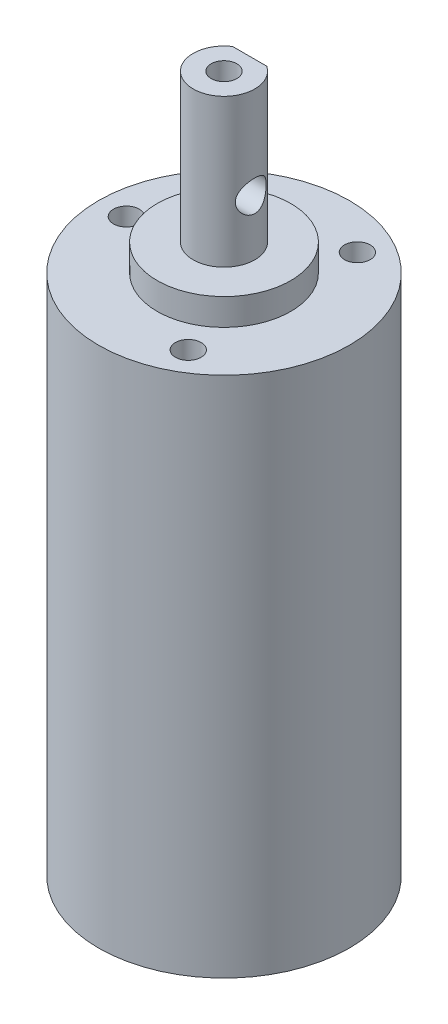
ISO-10303-21;
HEADER;
FILE_DESCRIPTION(('STEP AP214'),'2;1');
FILE_NAME('part.step','',(''),(''),'','','');
FILE_SCHEMA(('AUTOMOTIVE_DESIGN { 1 0 10303 214 1 1 1 1 }'));
ENDSEC;
DATA;
#1=APPLICATION_CONTEXT('core data for automotive mechanical design processes');
#2=APPLICATION_PROTOCOL_DEFINITION('international standard','automotive_design',2000,#1);
#3=PRODUCT_CONTEXT('',#1,'mechanical');
#4=PRODUCT('Part','Part','',(#3));
#5=PRODUCT_RELATED_PRODUCT_CATEGORY('part','',(#4));
#6=PRODUCT_DEFINITION_FORMATION('','',#4);
#7=PRODUCT_DEFINITION_CONTEXT('part definition',#1,'design');
#8=PRODUCT_DEFINITION('design','',#6,#7);
#9=PRODUCT_DEFINITION_SHAPE('','',#8);
#10=(LENGTH_UNIT() NAMED_UNIT(*) SI_UNIT(.MILLI.,.METRE.));
#11=(NAMED_UNIT(*) PLANE_ANGLE_UNIT() SI_UNIT($,.RADIAN.));
#12=(NAMED_UNIT(*) SI_UNIT($,.STERADIAN.) SOLID_ANGLE_UNIT());
#13=UNCERTAINTY_MEASURE_WITH_UNIT(LENGTH_MEASURE(1.E-05),#10,'distance_accuracy_value','');
#14=(GEOMETRIC_REPRESENTATION_CONTEXT(3) GLOBAL_UNCERTAINTY_ASSIGNED_CONTEXT((#13)) GLOBAL_UNIT_ASSIGNED_CONTEXT((#10,
#11,#12)) REPRESENTATION_CONTEXT('',''));
#15=CARTESIAN_POINT('',(0.,0.,0.));
#16=DIRECTION('',(0.,0.,1.));
#17=DIRECTION('',(1.,0.,0.));
#18=AXIS2_PLACEMENT_3D('',#15,#16,#17);
#19=CARTESIAN_POINT('',(-30.24092982811,133.5110309145,106.2415147261));
#20=DIRECTION('',(0.,1.,0.));
#21=DIRECTION('',(0.,0.,1.));
#22=AXIS2_PLACEMENT_3D('',#19,#20,#21);
#23=CONICAL_SURFACE('',#22,0.,1.02974425870939);
#24=CARTESIAN_POINT('',(-30.24092982811,133.5110309145,106.2415147261));
#25=VERTEX_POINT('',#24);
#26=VERTEX_LOOP('',#25);
#27=FACE_BOUND('',#26,.T.);
#28=CARTESIAN_POINT('',(-30.24092982811,134.2621066882,106.2415147261));
#29=DIRECTION('',(0.,1.,0.));
#30=DIRECTION('',(0.,0.,-1.));
#31=AXIS2_PLACEMENT_3D('',#28,#29,#30);
#32=CIRCLE('',#31,1.25000000000004);
#33=CARTESIAN_POINT('',(-30.24092982811,134.2621066882,104.9915147261));
#34=VERTEX_POINT('',#33);
#35=EDGE_CURVE('E142',#34,#34,#32,.F.);
#36=ORIENTED_EDGE('',*,*,#35,.F.);
#37=EDGE_LOOP('',(#36));
#38=FACE_BOUND('',#37,.T.);
#39=ADVANCED_FACE('F16',(#27,#38),#23,.F.);
#40=CARTESIAN_POINT('',(-30.24092982811,134.2621066882,106.2415147261));
#41=DIRECTION('',(0.,1.,0.));
#42=DIRECTION('',(0.,0.,1.));
#43=AXIS2_PLACEMENT_3D('',#40,#41,#42);
#44=CYLINDRICAL_SURFACE('',#43,1.25000000000003);
#45=CARTESIAN_POINT('',(-30.24092982811,139.7621066882,106.2415147261));
#46=DIRECTION('',(0.,1.,0.));
#47=DIRECTION('',(0.,0.,1.));
#48=AXIS2_PLACEMENT_3D('',#45,#46,#47);
#49=CIRCLE('',#48,1.25000000000003);
#50=CARTESIAN_POINT('',(-30.24092982811,139.7621066882,107.4915147261));
#51=VERTEX_POINT('',#50);
#52=EDGE_CURVE('E20',#51,#51,#49,.T.);
#53=ORIENTED_EDGE('',*,*,#52,.T.);
#54=EDGE_LOOP('',(#53));
#55=FACE_BOUND('',#54,.T.);
#56=ORIENTED_EDGE('',*,*,#35,.T.);
#57=EDGE_LOOP('',(#56));
#58=FACE_BOUND('',#57,.T.);
#59=ADVANCED_FACE('F266',(#55,#58),#44,.F.);
#60=CARTESIAN_POINT('',(-27.11965647509,139.7621066882,103.6315147261));
#61=DIRECTION('',(0.,-1.,0.));
#62=DIRECTION('',(0.,0.,1.));
#63=AXIS2_PLACEMENT_3D('',#60,#61,#62);
#64=PLANE('',#63);
#65=ORIENTED_EDGE('',*,*,#52,.F.);
#66=EDGE_LOOP('',(#65));
#67=FACE_BOUND('',#66,.T.);
#68=DIRECTION('',(-1.,0.,0.));
#69=VECTOR('',#68,1.);
#70=CARTESIAN_POINT('',(-30.240929828115,139.7621066882,103.7415147261));
#71=LINE('',#70,#69);
#72=CARTESIAN_POINT('',(-28.5826174329317,139.7621066882,103.7415147261));
#73=VERTEX_POINT('',#72);
#74=CARTESIAN_POINT('',(-31.8992422232878,139.7621066882,103.7415147261));
#75=VERTEX_POINT('',#74);
#76=EDGE_CURVE('E131',#73,#75,#71,.T.);
#77=ORIENTED_EDGE('',*,*,#76,.T.);
#78=CARTESIAN_POINT('',(-30.24092982811,139.7621066882,106.2415147261));
#79=DIRECTION('',(0.,1.,0.));
#80=DIRECTION('',(0.,0.,1.));
#81=AXIS2_PLACEMENT_3D('',#78,#79,#80);
#82=CIRCLE('',#81,3.00000000000002);
#83=EDGE_CURVE('E77',#75,#73,#82,.T.);
#84=ORIENTED_EDGE('',*,*,#83,.T.);
#85=EDGE_LOOP('',(#77,#84));
#86=FACE_BOUND('',#85,.T.);
#87=ADVANCED_FACE('F276',(#67,#86),#64,.F.);
#88=CARTESIAN_POINT('',(-28.48132464005,139.9921066882,103.7415147261));
#89=DIRECTION('',(0.,0.,1.));
#90=DIRECTION('',(-1.,0.,0.));
#91=AXIS2_PLACEMENT_3D('',#88,#89,#90);
#92=PLANE('',#91);
#93=ORIENTED_EDGE('',*,*,#76,.F.);
#94=DIRECTION('',(0.,-1.,0.));
#95=VECTOR('',#94,1.);
#96=CARTESIAN_POINT('',(-28.5826174329312,132.5621066882,103.741514726101));
#97=LINE('',#96,#95);
#98=CARTESIAN_POINT('',(-28.5826174329237,128.2621066882,103.741514726106));
#99=VERTEX_POINT('',#98);
#100=EDGE_CURVE('E132',#73,#99,#97,.T.);
#101=ORIENTED_EDGE('',*,*,#100,.T.);
#102=DIRECTION('',(1.,0.,0.));
#103=VECTOR('',#102,1.);
#104=CARTESIAN_POINT('',(-30.240929828115,128.2621066882,103.741514726111));
#105=LINE('',#104,#103);
#106=CARTESIAN_POINT('',(-31.8992422232958,128.2621066882,103.741514726105));
#107=VERTEX_POINT('',#106);
#108=EDGE_CURVE('E127',#107,#99,#105,.T.);
#109=ORIENTED_EDGE('',*,*,#108,.F.);
#110=DIRECTION('',(0.,1.,0.));
#111=VECTOR('',#110,1.);
#112=CARTESIAN_POINT('',(-31.8992422232878,132.5621066882,103.7415147261));
#113=LINE('',#112,#111);
#114=EDGE_CURVE('E130',#107,#75,#113,.T.);
#115=ORIENTED_EDGE('',*,*,#114,.T.);
#116=EDGE_LOOP('',(#93,#101,#109,#115));
#117=FACE_BOUND('',#116,.T.);
#118=ADVANCED_FACE('F278',(#117),#92,.F.);
#119=CARTESIAN_POINT('',(-28.48132464005,128.2621066882,103.842807519));
#120=DIRECTION('',(0.,1.,0.));
#121=DIRECTION('',(0.,0.,-1.));
#122=AXIS2_PLACEMENT_3D('',#119,#120,#121);
#123=PLANE('',#122);
#124=CARTESIAN_POINT('',(-30.24092982811,128.2621066882,106.2415147261));
#125=DIRECTION('',(0.,1.,0.));
#126=DIRECTION('',(0.,0.,1.));
#127=AXIS2_PLACEMENT_3D('',#124,#125,#126);
#128=CIRCLE('',#127,3.00000000000002);
#129=EDGE_CURVE('E83',#99,#107,#128,.T.);
#130=ORIENTED_EDGE('',*,*,#129,.T.);
#131=ORIENTED_EDGE('',*,*,#108,.T.);
#132=EDGE_LOOP('',(#130,#131));
#133=FACE_BOUND('',#132,.T.);
#134=ADVANCED_FACE('F262',(#133),#123,.T.);
#135=CARTESIAN_POINT('',(-33.2853238036323,130.7621066882,106.2415147261));
#136=DIRECTION('',(1.,0.,0.));
#137=DIRECTION('',(0.,0.,-1.));
#138=AXIS2_PLACEMENT_3D('',#135,#136,#137);
#139=CYLINDRICAL_SURFACE('',#138,1.49999999999999);
#140=CARTESIAN_POINT('',(-27.6428536167567,130.7621066882,104.7415147261));
#141=CARTESIAN_POINT('',(-27.6428477603225,130.84033262417,104.741519320605));
#142=CARTESIAN_POINT('',(-27.6392699054852,130.918604656265,104.747669911345));
#143=CARTESIAN_POINT('',(-27.6254852999889,131.07270498456,104.771945779615));
#144=CARTESIAN_POINT('',(-27.6152703311411,131.148530128639,104.790085903271));
#145=CARTESIAN_POINT('',(-27.5896908838176,131.295279452717,104.837362534096));
#146=CARTESIAN_POINT('',(-27.5743520639114,131.366225969908,104.86644433879));
#147=CARTESIAN_POINT('',(-27.5402933391923,131.502230254308,104.934606148255));
#148=CARTESIAN_POINT('',(-27.5215726218326,131.567286600673,104.973688556749));
#149=CARTESIAN_POINT('',(-27.4809764230692,131.695566637006,105.064515747349));
#150=CARTESIAN_POINT('',(-27.4589680985602,131.758197648499,105.117038524389));
#151=CARTESIAN_POINT('',(-27.4153493236102,131.874221103778,105.231636201916));
#152=CARTESIAN_POINT('',(-27.3937390616737,131.927609266221,105.293715504025));
#153=CARTESIAN_POINT('',(-27.3516077081944,132.02715734866,105.430780270438));
#154=CARTESIAN_POINT('',(-27.3312582945756,132.072587203727,105.50635370932));
#155=CARTESIAN_POINT('',(-27.2956685333971,132.149817866662,105.665278930494));
#156=CARTESIAN_POINT('',(-27.2804249784294,132.181627234183,105.748625787433));
#157=CARTESIAN_POINT('',(-27.2577229279904,132.228363642914,105.914447174233));
#158=CARTESIAN_POINT('',(-27.249787651682,132.244330923989,105.996561760009));
#159=CARTESIAN_POINT('',(-27.2408160741969,132.262355858363,106.162658496225));
#160=CARTESIAN_POINT('',(-27.2397756221048,132.264421880697,106.246639492459));
#161=CARTESIAN_POINT('',(-27.2444851036875,132.254986669662,106.406263658226));
#162=CARTESIAN_POINT('',(-27.2496524097742,132.244649628664,106.481996813983));
#163=CARTESIAN_POINT('',(-27.2653161890193,132.212785336855,106.630485662172));
#164=CARTESIAN_POINT('',(-27.2758130406679,132.191257291284,106.703241142741));
#165=CARTESIAN_POINT('',(-27.3013561813976,132.137482637118,106.844979378432));
#166=CARTESIAN_POINT('',(-27.3164634470906,132.105091752489,106.913895951756));
#167=CARTESIAN_POINT('',(-27.3498654278205,132.030710846309,107.045480931506));
#168=CARTESIAN_POINT('',(-27.3681612330393,131.988717540092,107.108147189349));
#169=CARTESIAN_POINT('',(-27.4082620563166,131.891768363245,107.231769457079));
#170=CARTESIAN_POINT('',(-27.4302353056701,131.835962848301,107.292005051284));
#171=CARTESIAN_POINT('',(-27.4741107890229,131.715232897263,107.402662365103));
#172=CARTESIAN_POINT('',(-27.4960129364639,131.650299907538,107.453074772138));
#173=CARTESIAN_POINT('',(-27.5387805116918,131.508094562784,107.545800441645));
#174=CARTESIAN_POINT('',(-27.5594897573667,131.430298327221,107.587388411701));
#175=CARTESIAN_POINT('',(-27.5953154692078,131.267588401397,107.656526951154));
#176=CARTESIAN_POINT('',(-27.6104442215047,131.182690857615,107.684108408668));
#177=CARTESIAN_POINT('',(-27.6284675967506,131.041189394481,107.71638243035));
#178=CARTESIAN_POINT('',(-27.6338230686247,130.985935509444,107.725781009089));
#179=CARTESIAN_POINT('',(-27.6410178770572,130.874497802961,107.738348266184));
#180=CARTESIAN_POINT('',(-27.6428578247635,130.818314144862,107.741518027376));
#181=CARTESIAN_POINT('',(-27.6428477603225,130.68388075223,107.741510131595));
#182=CARTESIAN_POINT('',(-27.6392699054852,130.605608720135,107.735359540855));
#183=CARTESIAN_POINT('',(-27.6254852999889,130.45150839184,107.711083672585));
#184=CARTESIAN_POINT('',(-27.6152703311411,130.375683247761,107.692943548929));
#185=CARTESIAN_POINT('',(-27.5896908838176,130.228933923683,107.645666918105));
#186=CARTESIAN_POINT('',(-27.5743520639115,130.157987406492,107.616585113411));
#187=CARTESIAN_POINT('',(-27.5402933391923,130.021983122092,107.548423303945));
#188=CARTESIAN_POINT('',(-27.5215726218326,129.956926775727,107.509340895451));
#189=CARTESIAN_POINT('',(-27.4809764230692,129.828646739394,107.418513704851));
#190=CARTESIAN_POINT('',(-27.4589680985602,129.766015727902,107.365990927811));
#191=CARTESIAN_POINT('',(-27.4153493236102,129.649992272622,107.251393250284));
#192=CARTESIAN_POINT('',(-27.3937390616737,129.596604110179,107.189313948175));
#193=CARTESIAN_POINT('',(-27.3516077081945,129.49705602774,107.052249181762));
#194=CARTESIAN_POINT('',(-27.3312582945756,129.451626172673,106.97667574288));
#195=CARTESIAN_POINT('',(-27.2956685333971,129.374395509738,106.817750521706));
#196=CARTESIAN_POINT('',(-27.2804249784294,129.342586142217,106.734403664767));
#197=CARTESIAN_POINT('',(-27.2577229279904,129.295849733486,106.568582277967));
#198=CARTESIAN_POINT('',(-27.249787651682,129.279882452411,106.486467692191));
#199=CARTESIAN_POINT('',(-27.240816074197,129.261857518037,106.320370955975));
#200=CARTESIAN_POINT('',(-27.2397756221048,129.259791495703,106.236389959741));
#201=CARTESIAN_POINT('',(-27.2444851036875,129.269226706738,106.076765793974));
#202=CARTESIAN_POINT('',(-27.2496524097742,129.279563747735,106.001032638217));
#203=CARTESIAN_POINT('',(-27.2653161890193,129.311428039545,105.852543790028));
#204=CARTESIAN_POINT('',(-27.2758130406679,129.332956085115,105.779788309459));
#205=CARTESIAN_POINT('',(-27.3013561813975,129.386730739282,105.638050073768));
#206=CARTESIAN_POINT('',(-27.3164634470905,129.419121623911,105.569133500444));
#207=CARTESIAN_POINT('',(-27.3498654278205,129.493502530091,105.437548520694));
#208=CARTESIAN_POINT('',(-27.3681612330393,129.535495836308,105.374882262851));
#209=CARTESIAN_POINT('',(-27.4082620563166,129.632445013155,105.251259995121));
#210=CARTESIAN_POINT('',(-27.43023530567,129.688250528099,105.191024400916));
#211=CARTESIAN_POINT('',(-27.4741107890229,129.808980479137,105.080367087097));
#212=CARTESIAN_POINT('',(-27.4960129364638,129.873913468862,105.029954680062));
#213=CARTESIAN_POINT('',(-27.5387805116918,130.016118813616,104.937229010555));
#214=CARTESIAN_POINT('',(-27.5594897573667,130.093915049178,104.895641040499));
#215=CARTESIAN_POINT('',(-27.5953154692078,130.256624975003,104.826502501046));
#216=CARTESIAN_POINT('',(-27.6104442215047,130.341522518785,104.798921043532));
#217=CARTESIAN_POINT('',(-27.6284675967506,130.483023981919,104.76664702185));
#218=CARTESIAN_POINT('',(-27.6338230686247,130.538277866956,104.757248443111));
#219=CARTESIAN_POINT('',(-27.6410178770572,130.649715573439,104.744681186016));
#220=CARTESIAN_POINT('',(-27.6428578247635,130.705899231538,104.741511424824));
#221=CARTESIAN_POINT('',(-27.6428536167567,130.7621066882,104.7415147261));
#222=B_SPLINE_CURVE_WITH_KNOTS('',3,(#140,#141,#142,#143,#144,#145,#146,#147,#148,#149,#150,
#151,#152,#153,#154,#155,#156,#157,#158,#159,#160,#161,#162,#163,#164,#165,#166,#167,#168,#169,
#170,#171,#172,#173,#174,#175,#176,#177,#178,#179,#180,#181,#182,#183,#184,#185,#186,#187,#188,
#189,#190,#191,#192,#193,#194,#195,#196,#197,#198,#199,#200,#201,#202,#203,#204,#205,#206,#207,
#208,#209,#210,#211,#212,#213,#214,#215,#216,#217,#218,#219,#220,#221),.UNSPECIFIED.,.T.,.F.,(4,
2,2,2,2,2,2,2,2,2,2,2,2,2,2,2,2,2,2,2,2,2,2,2,2,2,2,2,2,2,2,2,2,2,2,2,2,2,2,2,4),(0.,
0.234449231901209,0.469189317529201,0.702771096664719,0.936409071807249,1.18929789692149,
1.44230355005485,1.71236795365525,1.98226238811297,2.23295183209194,2.48349033889637,
2.71224188129933,2.94100967129785,3.17294484424671,3.4049594734386,3.65888530601413,
3.91305070653475,4.18349069032567,4.45333166290755,4.6218190877885,4.79027721971543,
5.02472645161661,5.2594665372446,5.49304831638011,5.72668629152262,5.97957511663684,
6.23258076977018,6.5026451733706,6.77253960782835,7.02322905180731,7.27376755861176,
7.50251910101472,7.73128689101325,7.96322206396209,8.19523669315399,8.44916252572951,
8.70332792625011,8.97376791004105,9.24360888262294,9.41209630750402,9.58055443943098),.UNSPECIFIED.);
#223=CARTESIAN_POINT('',(-27.6428536167567,130.7621066882,104.7415147261));
#224=VERTEX_POINT('',#223);
#225=EDGE_CURVE('E245',#224,#224,#222,.T.);
#226=ORIENTED_EDGE('',*,*,#225,.T.);
#227=EDGE_LOOP('',(#226));
#228=FACE_BOUND('',#227,.T.);
#229=CARTESIAN_POINT('',(-32.8390060394633,130.7621066882,104.7415147261));
#230=CARTESIAN_POINT('',(-32.8390118958975,130.683880752231,104.741519320605));
#231=CARTESIAN_POINT('',(-32.8425897507348,130.605608720136,104.747669911345));
#232=CARTESIAN_POINT('',(-32.8563743562311,130.45150839184,104.771945779615));
#233=CARTESIAN_POINT('',(-32.8665893250788,130.375683247761,104.790085903271));
#234=CARTESIAN_POINT('',(-32.8921687724024,130.228933923684,104.837362534095));
#235=CARTESIAN_POINT('',(-32.9075075923085,130.157987406492,104.866444338789));
#236=CARTESIAN_POINT('',(-32.9415663170276,130.021983122092,104.934606148255));
#237=CARTESIAN_POINT('',(-32.9602870343873,129.956926775727,104.973688556749));
#238=CARTESIAN_POINT('',(-33.0008832331507,129.828646739394,105.064515747349));
#239=CARTESIAN_POINT('',(-33.0228915576597,129.766015727902,105.117038524388));
#240=CARTESIAN_POINT('',(-33.0665103326097,129.649992272623,105.231636201916));
#241=CARTESIAN_POINT('',(-33.0881205945463,129.596604110179,105.293715504025));
#242=CARTESIAN_POINT('',(-33.1302519480255,129.49705602774,105.430780270438));
#243=CARTESIAN_POINT('',(-33.1506013616444,129.451626172673,105.50635370932));
#244=CARTESIAN_POINT('',(-33.1861911228229,129.374395509738,105.665278930494));
#245=CARTESIAN_POINT('',(-33.2014346777906,129.342586142217,105.748625787433));
#246=CARTESIAN_POINT('',(-33.2241367282296,129.295849733486,105.914447174233));
#247=CARTESIAN_POINT('',(-33.2320720045379,129.279882452411,105.996561760009));
#248=CARTESIAN_POINT('',(-33.241043582023,129.261857518037,106.162658496224));
#249=CARTESIAN_POINT('',(-33.2420840341152,129.259791495703,106.246639492458));
#250=CARTESIAN_POINT('',(-33.2373745525325,129.269226706738,106.406263658225));
#251=CARTESIAN_POINT('',(-33.2322072464459,129.279563747735,106.481996813983));
#252=CARTESIAN_POINT('',(-33.2165434672007,129.311428039545,106.630485662172));
#253=CARTESIAN_POINT('',(-33.2060466155522,129.332956085115,106.703241142741));
#254=CARTESIAN_POINT('',(-33.1805034748225,129.386730739282,106.844979378432));
#255=CARTESIAN_POINT('',(-33.1653962091295,129.419121623911,106.913895951756));
#256=CARTESIAN_POINT('',(-33.1319942283995,129.493502530091,107.045480931506));
#257=CARTESIAN_POINT('',(-33.1136984231807,129.535495836308,107.108147189349));
#258=CARTESIAN_POINT('',(-33.0735975999035,129.632445013155,107.231769457079));
#259=CARTESIAN_POINT('',(-33.05162435055,129.688250528098,107.292005051283));
#260=CARTESIAN_POINT('',(-33.0077488671972,129.808980479136,107.402662365102));
#261=CARTESIAN_POINT('',(-32.9858467197562,129.873913468862,107.453074772138));
#262=CARTESIAN_POINT('',(-32.9430791445283,130.016118813616,107.545800441645));
#263=CARTESIAN_POINT('',(-32.9223698988534,130.093915049178,107.587388411701));
#264=CARTESIAN_POINT('',(-32.8865441870123,130.256624975002,107.656526951153));
#265=CARTESIAN_POINT('',(-32.8714154347154,130.341522518785,107.684108408668));
#266=CARTESIAN_POINT('',(-32.8533920594694,130.483023981919,107.71638243035));
#267=CARTESIAN_POINT('',(-32.8480365875954,130.538277866956,107.725781009089));
#268=CARTESIAN_POINT('',(-32.8408417791628,130.649715573439,107.738348266184));
#269=CARTESIAN_POINT('',(-32.8390018314565,130.705899231537,107.741518027376));
#270=CARTESIAN_POINT('',(-32.8390118958975,130.840332624169,107.741510131595));
#271=CARTESIAN_POINT('',(-32.8425897507348,130.918604656265,107.735359540855));
#272=CARTESIAN_POINT('',(-32.8563743562311,131.07270498456,107.711083672585));
#273=CARTESIAN_POINT('',(-32.8665893250789,131.148530128639,107.692943548929));
#274=CARTESIAN_POINT('',(-32.8921687724024,131.295279452717,107.645666918105));
#275=CARTESIAN_POINT('',(-32.9075075923085,131.366225969908,107.616585113411));
#276=CARTESIAN_POINT('',(-32.9415663170277,131.502230254308,107.548423303945));
#277=CARTESIAN_POINT('',(-32.9602870343873,131.567286600673,107.509340895451));
#278=CARTESIAN_POINT('',(-33.0008832331508,131.695566637006,107.418513704851));
#279=CARTESIAN_POINT('',(-33.0228915576598,131.758197648498,107.365990927811));
#280=CARTESIAN_POINT('',(-33.0665103326097,131.874221103778,107.251393250284));
#281=CARTESIAN_POINT('',(-33.0881205945463,131.927609266221,107.189313948175));
#282=CARTESIAN_POINT('',(-33.1302519480255,132.02715734866,107.052249181762));
#283=CARTESIAN_POINT('',(-33.1506013616444,132.072587203727,106.97667574288));
#284=CARTESIAN_POINT('',(-33.1861911228229,132.149817866662,106.817750521706));
#285=CARTESIAN_POINT('',(-33.2014346777906,132.181627234183,106.734403664767));
#286=CARTESIAN_POINT('',(-33.2241367282296,132.228363642914,106.568582277967));
#287=CARTESIAN_POINT('',(-33.2320720045379,132.244330923989,106.486467692191));
#288=CARTESIAN_POINT('',(-33.241043582023,132.262355858363,106.320370955975));
#289=CARTESIAN_POINT('',(-33.2420840341152,132.264421880697,106.236389959741));
#290=CARTESIAN_POINT('',(-33.2373745525325,132.254986669662,106.076765793974));
#291=CARTESIAN_POINT('',(-33.2322072464458,132.244649628664,106.001032638217));
#292=CARTESIAN_POINT('',(-33.2165434672007,132.212785336855,105.852543790028));
#293=CARTESIAN_POINT('',(-33.2060466155521,132.191257291284,105.779788309459));
#294=CARTESIAN_POINT('',(-33.1805034748225,132.137482637118,105.638050073768));
#295=CARTESIAN_POINT('',(-33.1653962091295,132.105091752489,105.569133500444));
#296=CARTESIAN_POINT('',(-33.1319942283995,132.030710846309,105.437548520694));
#297=CARTESIAN_POINT('',(-33.1136984231807,131.988717540092,105.374882262851));
#298=CARTESIAN_POINT('',(-33.0735975999034,131.891768363245,105.251259995121));
#299=CARTESIAN_POINT('',(-33.05162435055,131.835962848302,105.191024400916));
#300=CARTESIAN_POINT('',(-33.0077488671971,131.715232897263,105.080367087097));
#301=CARTESIAN_POINT('',(-32.9858467197562,131.650299907538,105.029954680062));
#302=CARTESIAN_POINT('',(-32.9430791445283,131.508094562784,104.937229010555));
#303=CARTESIAN_POINT('',(-32.9223698988533,131.430298327222,104.895641040499));
#304=CARTESIAN_POINT('',(-32.8865441870122,131.267588401398,104.826502501047));
#305=CARTESIAN_POINT('',(-32.8714154347154,131.182690857615,104.798921043532));
#306=CARTESIAN_POINT('',(-32.8533920594694,131.041189394481,104.76664702185));
#307=CARTESIAN_POINT('',(-32.8480365875954,130.985935509444,104.757248443111));
#308=CARTESIAN_POINT('',(-32.8408417791628,130.874497802961,104.744681186016));
#309=CARTESIAN_POINT('',(-32.8390018314565,130.818314144863,104.741511424824));
#310=CARTESIAN_POINT('',(-32.8390060394633,130.7621066882,104.7415147261));
#311=B_SPLINE_CURVE_WITH_KNOTS('',3,(#229,#230,#231,#232,#233,#234,#235,#236,#237,#238,#239,
#240,#241,#242,#243,#244,#245,#246,#247,#248,#249,#250,#251,#252,#253,#254,#255,#256,#257,#258,
#259,#260,#261,#262,#263,#264,#265,#266,#267,#268,#269,#270,#271,#272,#273,#274,#275,#276,#277,
#278,#279,#280,#281,#282,#283,#284,#285,#286,#287,#288,#289,#290,#291,#292,#293,#294,#295,#296,
#297,#298,#299,#300,#301,#302,#303,#304,#305,#306,#307,#308,#309,#310),.UNSPECIFIED.,.T.,.F.,(4,
2,2,2,2,2,2,2,2,2,2,2,2,2,2,2,2,2,2,2,2,2,2,2,2,2,2,2,2,2,2,2,2,2,2,2,2,2,2,2,4),(0.,
0.234449231901177,0.469189317529156,0.702771096664656,0.936409071807156,1.18929789692138,
1.44230355005473,1.71236795365512,1.98226238811286,2.23295183209185,2.4834903388963,
2.71224188129928,2.94100967129784,3.17294484424668,3.40495947343852,3.65888530601403,
3.91305070653466,4.18349069032558,4.45333166290746,4.62181908778858,4.79027721971562,
5.0247264516168,5.25946653724479,5.49304831638032,5.72668629152281,5.97957511663706,
6.23258076977039,6.50264517337078,6.77253960782852,7.02322905180751,7.27376755861194,
7.50251910101491,7.73128689101346,7.96322206396231,8.19523669315416,8.44916252572969,
8.70332792625032,8.97376791004121,9.2436088826231,9.41209630750414,9.58055443943101),.UNSPECIFIED.);
#312=CARTESIAN_POINT('',(-32.8390060394633,130.7621066882,104.7415147261));
#313=VERTEX_POINT('',#312);
#314=EDGE_CURVE('E141',#313,#313,#311,.T.);
#315=ORIENTED_EDGE('',*,*,#314,.T.);
#316=EDGE_LOOP('',(#315));
#317=FACE_BOUND('',#316,.T.);
#318=ADVANCED_FACE('F258',(#228,#317),#139,.F.);
#319=CARTESIAN_POINT('',(-30.24092982811,125.3621066882,106.2415147261));
#320=DIRECTION('',(0.,1.,0.));
#321=DIRECTION('',(0.,0.,1.));
#322=AXIS2_PLACEMENT_3D('',#319,#320,#321);
#323=CYLINDRICAL_SURFACE('',#322,3.00000000000002);
#324=ORIENTED_EDGE('',*,*,#83,.F.);
#325=ORIENTED_EDGE('',*,*,#114,.F.);
#326=ORIENTED_EDGE('',*,*,#129,.F.);
#327=ORIENTED_EDGE('',*,*,#100,.F.);
#328=EDGE_LOOP('',(#324,#325,#326,#327));
#329=FACE_BOUND('',#328,.T.);
#330=ORIENTED_EDGE('',*,*,#225,.F.);
#331=EDGE_LOOP('',(#330));
#332=FACE_BOUND('',#331,.T.);
#333=CARTESIAN_POINT('',(-30.24092982811,125.3621066882,106.2415147261));
#334=DIRECTION('',(0.,1.,0.));
#335=DIRECTION('',(0.,0.,1.));
#336=AXIS2_PLACEMENT_3D('',#333,#334,#335);
#337=CIRCLE('',#336,3.00000000000002);
#338=CARTESIAN_POINT('',(-30.24092982811,125.3621066882,109.2415147261));
#339=VERTEX_POINT('',#338);
#340=EDGE_CURVE('E241',#339,#339,#337,.T.);
#341=ORIENTED_EDGE('',*,*,#340,.T.);
#342=EDGE_LOOP('',(#341));
#343=FACE_BOUND('',#342,.T.);
#344=ORIENTED_EDGE('',*,*,#314,.F.);
#345=EDGE_LOOP('',(#344));
#346=FACE_BOUND('',#345,.T.);
#347=ADVANCED_FACE('F255',(#329,#332,#343,#346),#323,.T.);
#348=CARTESIAN_POINT('',(-27.11475920238,67.96210668824,109.3615147261));
#349=DIRECTION('',(0.,1.,0.));
#350=DIRECTION('',(0.,0.,-1.));
#351=AXIS2_PLACEMENT_3D('',#348,#349,#350);
#352=PLANE('',#351);
#353=CARTESIAN_POINT('',(-30.24092982811,67.9621066882454,106.2415147261));
#354=DIRECTION('',(0.,1.,0.));
#355=DIRECTION('',(0.,0.,1.));
#356=AXIS2_PLACEMENT_3D('',#353,#354,#355);
#357=CIRCLE('',#356,3.00000000000002);
#358=CARTESIAN_POINT('',(-30.24092982811,67.9621066882454,109.2415147261));
#359=VERTEX_POINT('',#358);
#360=EDGE_CURVE('E126',#359,#359,#357,.F.);
#361=ORIENTED_EDGE('',*,*,#360,.T.);
#362=EDGE_LOOP('',(#361));
#363=FACE_BOUND('',#362,.T.);
#364=ADVANCED_FACE('F283',(#363),#352,.F.);
#365=CARTESIAN_POINT('',(-39.74092982811,118.0110309145,106.2415147261));
#366=DIRECTION('',(0.,1.,0.));
#367=DIRECTION('',(0.,0.,1.));
#368=AXIS2_PLACEMENT_3D('',#365,#366,#367);
#369=CONICAL_SURFACE('',#368,0.,1.02974425870939);
#370=CARTESIAN_POINT('',(-39.74092982811,118.0110309145,106.2415147261));
#371=VERTEX_POINT('',#370);
#372=VERTEX_LOOP('',#371);
#373=FACE_BOUND('',#372,.T.);
#374=CARTESIAN_POINT('',(-39.74092982811,118.762106688284,106.2415147261));
#375=DIRECTION('',(0.,1.,0.));
#376=DIRECTION('',(0.,0.,-1.));
#377=AXIS2_PLACEMENT_3D('',#374,#375,#376);
#378=CIRCLE('',#377,1.25000000000003);
#379=CARTESIAN_POINT('',(-39.74092982811,118.762106688284,104.9915147261));
#380=VERTEX_POINT('',#379);
#381=EDGE_CURVE('E117',#380,#380,#378,.F.);
#382=ORIENTED_EDGE('',*,*,#381,.F.);
#383=EDGE_LOOP('',(#382));
#384=FACE_BOUND('',#383,.T.);
#385=ADVANCED_FACE('F323',(#373,#384),#369,.F.);
#386=CARTESIAN_POINT('',(-25.49092982811,118.0110309145,114.468756062));
#387=DIRECTION('',(0.,1.,0.));
#388=DIRECTION('',(0.,0.,1.));
#389=AXIS2_PLACEMENT_3D('',#386,#387,#388);
#390=CONICAL_SURFACE('',#389,0.,1.02974425867637);
#391=CARTESIAN_POINT('',(-25.49092982811,118.0110309145,114.468756062));
#392=VERTEX_POINT('',#391);
#393=VERTEX_LOOP('',#392);
#394=FACE_BOUND('',#393,.T.);
#395=CARTESIAN_POINT('',(-25.49092982811,118.762106688284,114.468756062));
#396=DIRECTION('',(0.,1.,0.));
#397=DIRECTION('',(0.,0.,-1.));
#398=AXIS2_PLACEMENT_3D('',#395,#396,#397);
#399=CIRCLE('',#398,1.24999999999999);
#400=CARTESIAN_POINT('',(-25.49092982811,118.762106688284,113.218756062));
#401=VERTEX_POINT('',#400);
#402=EDGE_CURVE('E107',#401,#401,#399,.F.);
#403=ORIENTED_EDGE('',*,*,#402,.F.);
#404=EDGE_LOOP('',(#403));
#405=FACE_BOUND('',#404,.T.);
#406=ADVANCED_FACE('F99',(#394,#405),#390,.F.);
#407=CARTESIAN_POINT('',(-25.49092982811,118.0110309145,98.01427339011));
#408=DIRECTION('',(0.,1.,0.));
#409=DIRECTION('',(0.,0.,1.));
#410=AXIS2_PLACEMENT_3D('',#407,#408,#409);
#411=CONICAL_SURFACE('',#410,0.,1.02974425869286);
#412=CARTESIAN_POINT('',(-25.49092982811,118.0110309145,98.01427339011));
#413=VERTEX_POINT('',#412);
#414=VERTEX_LOOP('',#413);
#415=FACE_BOUND('',#414,.T.);
#416=CARTESIAN_POINT('',(-25.49092982811,118.762106688284,98.01427339011));
#417=DIRECTION('',(0.,1.,0.));
#418=DIRECTION('',(0.,0.,-1.));
#419=AXIS2_PLACEMENT_3D('',#416,#417,#418);
#420=CIRCLE('',#419,1.25);
#421=CARTESIAN_POINT('',(-25.49092982811,118.762106688284,96.76427339011));
#422=VERTEX_POINT('',#421);
#423=EDGE_CURVE('E103',#422,#422,#420,.F.);
#424=ORIENTED_EDGE('',*,*,#423,.F.);
#425=EDGE_LOOP('',(#424));
#426=FACE_BOUND('',#425,.T.);
#427=ADVANCED_FACE('F95',(#415,#426),#411,.F.);
#428=CARTESIAN_POINT('',(-23.48094256336,125.3621066882,99.48151472607));
#429=DIRECTION('',(0.,-1.,0.));
#430=DIRECTION('',(0.,0.,1.));
#431=AXIS2_PLACEMENT_3D('',#428,#429,#430);
#432=PLANE('',#431);
#433=ORIENTED_EDGE('',*,*,#340,.F.);
#434=EDGE_LOOP('',(#433));
#435=FACE_BOUND('',#434,.T.);
#436=CARTESIAN_POINT('',(-30.24092982811,125.362106688217,106.2415147261));
#437=DIRECTION('',(0.,1.,0.));
#438=DIRECTION('',(-1.,0.,0.));
#439=AXIS2_PLACEMENT_3D('',#436,#437,#438);
#440=CIRCLE('',#439,6.50000000003002);
#441=CARTESIAN_POINT('',(-36.74092982814,125.362106688217,106.2415147261));
#442=VERTEX_POINT('',#441);
#443=EDGE_CURVE('E106',#442,#442,#440,.T.);
#444=ORIENTED_EDGE('',*,*,#443,.T.);
#445=EDGE_LOOP('',(#444));
#446=FACE_BOUND('',#445,.T.);
#447=ADVANCED_FACE('F98',(#435,#446),#432,.F.);
#448=CARTESIAN_POINT('',(-30.24092982811,67.9621066882454,106.2415147261));
#449=DIRECTION('',(0.,1.,0.));
#450=DIRECTION('',(0.,0.,1.));
#451=AXIS2_PLACEMENT_3D('',#448,#449,#450);
#452=CYLINDRICAL_SURFACE('',#451,3.00000000000002);
#453=CARTESIAN_POINT('',(-30.24092982811,71.9621066882445,106.2415147261));
#454=DIRECTION('',(0.,1.,0.));
#455=DIRECTION('',(0.,0.,1.));
#456=AXIS2_PLACEMENT_3D('',#453,#454,#455);
#457=CIRCLE('',#456,3.00000000000002);
#458=CARTESIAN_POINT('',(-30.24092982811,71.9621066882445,109.2415147261));
#459=VERTEX_POINT('',#458);
#460=EDGE_CURVE('E113',#459,#459,#457,.F.);
#461=ORIENTED_EDGE('',*,*,#460,.T.);
#462=EDGE_LOOP('',(#461));
#463=FACE_BOUND('',#462,.T.);
#464=ORIENTED_EDGE('',*,*,#360,.F.);
#465=EDGE_LOOP('',(#464));
#466=FACE_BOUND('',#465,.T.);
#467=ADVANCED_FACE('F293',(#463,#466),#452,.T.);
#468=CARTESIAN_POINT('',(-39.74092982811,118.762106688284,106.2415147261));
#469=DIRECTION('',(0.,1.,0.));
#470=DIRECTION('',(-1.,0.,0.));
#471=AXIS2_PLACEMENT_3D('',#468,#469,#470);
#472=CYLINDRICAL_SURFACE('',#471,1.25000000000003);
#473=CARTESIAN_POINT('',(-39.74092982811,122.762106688216,106.2415147261));
#474=DIRECTION('',(0.,1.,0.));
#475=DIRECTION('',(-1.,0.,0.));
#476=AXIS2_PLACEMENT_3D('',#473,#474,#475);
#477=CIRCLE('',#476,1.25000000000003);
#478=CARTESIAN_POINT('',(-40.99092982811,122.762106688216,106.2415147261));
#479=VERTEX_POINT('',#478);
#480=EDGE_CURVE('E232',#479,#479,#477,.T.);
#481=ORIENTED_EDGE('',*,*,#480,.T.);
#482=EDGE_LOOP('',(#481));
#483=FACE_BOUND('',#482,.T.);
#484=ORIENTED_EDGE('',*,*,#381,.T.);
#485=EDGE_LOOP('',(#484));
#486=FACE_BOUND('',#485,.T.);
#487=ADVANCED_FACE('F316',(#483,#486),#472,.F.);
#488=CARTESIAN_POINT('',(-25.49092982811,118.762106688284,114.468756062));
#489=DIRECTION('',(0.,1.,0.));
#490=DIRECTION('',(-1.,0.,0.));
#491=AXIS2_PLACEMENT_3D('',#488,#489,#490);
#492=CYLINDRICAL_SURFACE('',#491,1.24999999999999);
#493=CARTESIAN_POINT('',(-25.49092982811,122.762106688216,114.468756062));
#494=DIRECTION('',(0.,1.,0.));
#495=DIRECTION('',(-1.,0.,0.));
#496=AXIS2_PLACEMENT_3D('',#493,#494,#495);
#497=CIRCLE('',#496,1.24999999999999);
#498=CARTESIAN_POINT('',(-26.74092982811,122.762106688216,114.468756062));
#499=VERTEX_POINT('',#498);
#500=EDGE_CURVE('E228',#499,#499,#497,.T.);
#501=ORIENTED_EDGE('',*,*,#500,.T.);
#502=EDGE_LOOP('',(#501));
#503=FACE_BOUND('',#502,.T.);
#504=ORIENTED_EDGE('',*,*,#402,.T.);
#505=EDGE_LOOP('',(#504));
#506=FACE_BOUND('',#505,.T.);
#507=ADVANCED_FACE('F319',(#503,#506),#492,.F.);
#508=CARTESIAN_POINT('',(-25.49092982811,118.762106688284,98.01427339011));
#509=DIRECTION('',(0.,1.,0.));
#510=DIRECTION('',(-1.,0.,0.));
#511=AXIS2_PLACEMENT_3D('',#508,#509,#510);
#512=CYLINDRICAL_SURFACE('',#511,1.25);
#513=CARTESIAN_POINT('',(-25.49092982811,122.762106688216,98.01427339011));
#514=DIRECTION('',(0.,1.,0.));
#515=DIRECTION('',(-1.,0.,0.));
#516=AXIS2_PLACEMENT_3D('',#513,#514,#515);
#517=CIRCLE('',#516,1.25);
#518=CARTESIAN_POINT('',(-26.74092982811,122.762106688216,98.01427339011));
#519=VERTEX_POINT('',#518);
#520=EDGE_CURVE('E224',#519,#519,#517,.T.);
#521=ORIENTED_EDGE('',*,*,#520,.T.);
#522=EDGE_LOOP('',(#521));
#523=FACE_BOUND('',#522,.T.);
#524=ORIENTED_EDGE('',*,*,#423,.T.);
#525=EDGE_LOOP('',(#524));
#526=FACE_BOUND('',#525,.T.);
#527=ADVANCED_FACE('F301',(#523,#526),#512,.F.);
#528=CARTESIAN_POINT('',(-30.24092982811,122.762106688283,106.2415147261));
#529=DIRECTION('',(0.,1.,0.));
#530=DIRECTION('',(-1.,0.,0.));
#531=AXIS2_PLACEMENT_3D('',#528,#529,#530);
#532=CYLINDRICAL_SURFACE('',#531,6.50000000003002);
#533=ORIENTED_EDGE('',*,*,#443,.F.);
#534=EDGE_LOOP('',(#533));
#535=FACE_BOUND('',#534,.T.);
#536=CARTESIAN_POINT('',(-30.24092982811,122.762106688283,106.2415147261));
#537=DIRECTION('',(0.,1.,0.));
#538=DIRECTION('',(-1.,0.,0.));
#539=AXIS2_PLACEMENT_3D('',#536,#537,#538);
#540=CIRCLE('',#539,6.50000000003002);
#541=CARTESIAN_POINT('',(-36.74092982814,122.762106688283,106.2415147261));
#542=VERTEX_POINT('',#541);
#543=EDGE_CURVE('E220',#542,#542,#540,.T.);
#544=ORIENTED_EDGE('',*,*,#543,.T.);
#545=EDGE_LOOP('',(#544));
#546=FACE_BOUND('',#545,.T.);
#547=ADVANCED_FACE('F297',(#535,#546),#532,.T.);
#548=CARTESIAN_POINT('',(-17.54076342485,71.96210668824,118.9295147261));
#549=DIRECTION('',(0.,1.,0.));
#550=DIRECTION('',(0.,0.,-1.));
#551=AXIS2_PLACEMENT_3D('',#548,#549,#550);
#552=PLANE('',#551);
#553=ORIENTED_EDGE('',*,*,#460,.F.);
#554=EDGE_LOOP('',(#553));
#555=FACE_BOUND('',#554,.T.);
#556=CARTESIAN_POINT('',(-30.24092982811,71.9621066882393,106.2415147261));
#557=DIRECTION('',(0.,1.,0.));
#558=DIRECTION('',(0.,0.,1.));
#559=AXIS2_PLACEMENT_3D('',#556,#557,#558);
#560=CIRCLE('',#559,12.20000000003);
#561=CARTESIAN_POINT('',(-30.24092982811,71.9621066882393,118.44151472613));
#562=VERTEX_POINT('',#561);
#563=EDGE_CURVE('E210',#562,#562,#560,.F.);
#564=ORIENTED_EDGE('',*,*,#563,.T.);
#565=EDGE_LOOP('',(#564));
#566=FACE_BOUND('',#565,.T.);
#567=ADVANCED_FACE('F300',(#555,#566),#552,.F.);
#568=CARTESIAN_POINT('',(-17.54076342485,122.7621066882,93.55351472607));
#569=DIRECTION('',(0.,-1.,0.));
#570=DIRECTION('',(0.,0.,1.));
#571=AXIS2_PLACEMENT_3D('',#568,#569,#570);
#572=PLANE('',#571);
#573=ORIENTED_EDGE('',*,*,#543,.F.);
#574=EDGE_LOOP('',(#573));
#575=FACE_BOUND('',#574,.T.);
#576=ORIENTED_EDGE('',*,*,#520,.F.);
#577=EDGE_LOOP('',(#576));
#578=FACE_BOUND('',#577,.T.);
#579=ORIENTED_EDGE('',*,*,#500,.F.);
#580=EDGE_LOOP('',(#579));
#581=FACE_BOUND('',#580,.T.);
#582=ORIENTED_EDGE('',*,*,#480,.F.);
#583=EDGE_LOOP('',(#582));
#584=FACE_BOUND('',#583,.T.);
#585=CARTESIAN_POINT('',(-30.24092982811,122.762106688199,106.2415147261));
#586=DIRECTION('',(0.,1.,0.));
#587=DIRECTION('',(0.,0.,1.));
#588=AXIS2_PLACEMENT_3D('',#585,#586,#587);
#589=CIRCLE('',#588,12.20000000003);
#590=CARTESIAN_POINT('',(-30.24092982811,122.762106688199,118.44151472613));
#591=VERTEX_POINT('',#590);
#592=EDGE_CURVE('E203',#591,#591,#589,.T.);
#593=ORIENTED_EDGE('',*,*,#592,.T.);
#594=EDGE_LOOP('',(#593));
#595=FACE_BOUND('',#594,.T.);
#596=ADVANCED_FACE('F305',(#575,#578,#581,#584,#595),#572,.F.);
#597=CARTESIAN_POINT('',(-36.69301058157,84.96210668824,101.6526971583));
#598=DIRECTION('',(0.,1.,0.));
#599=DIRECTION('',(0.,0.,-1.));
#600=AXIS2_PLACEMENT_3D('',#597,#598,#599);
#601=PLANE('',#600);
#602=DIRECTION('',(0.642787609686886,0.,-0.766044443118687));
#603=VECTOR('',#602,1.);
#604=CARTESIAN_POINT('',(-47.24711646535,84.96210668825,91.971629791025));
#605=LINE('',#604,#603);
#606=CARTESIAN_POINT('',(-49.4968730992019,84.9621066882475,94.6527853418854));
#607=VERTEX_POINT('',#606);
#608=CARTESIAN_POINT('',(-44.997359832214,84.9621066888987,89.2904742411745));
#609=VERTEX_POINT('',#608);
#610=EDGE_CURVE('E348',#607,#609,#605,.T.);
#611=ORIENTED_EDGE('',*,*,#610,.F.);
#612=DIRECTION('',(0.766044443117625,0.,0.642787609688152));
#613=VECTOR('',#612,1.);
#614=CARTESIAN_POINT('',(-49.4968730992501,84.96210668824,94.6527853419644));
#615=LINE('',#614,#613);
#616=CARTESIAN_POINT('',(-41.4435799771783,84.9621066882359,101.410300630418));
#617=VERTEX_POINT('',#616);
#618=EDGE_CURVE('E216',#607,#617,#615,.T.);
#619=ORIENTED_EDGE('',*,*,#618,.T.);
#620=CARTESIAN_POINT('',(-30.24092982811,84.9621066882318,106.2415147261));
#621=DIRECTION('',(0.,1.,0.));
#622=DIRECTION('',(0.,0.,1.));
#623=AXIS2_PLACEMENT_3D('',#620,#621,#622);
#624=CIRCLE('',#623,12.20000000003);
#625=CARTESIAN_POINT('',(-36.9440667097886,84.9621066885382,96.0479895290459));
#626=VERTEX_POINT('',#625);
#627=EDGE_CURVE('E194',#617,#626,#624,.F.);
#628=ORIENTED_EDGE('',*,*,#627,.T.);
#629=DIRECTION('',(-0.766044443161991,6.68451305095133E-11,-0.642787609635278));
#630=VECTOR('',#629,1.);
#631=CARTESIAN_POINT('',(-40.7566688630051,84.9621066891773,92.8488364688907));
#632=LINE('',#631,#630);
#633=EDGE_CURVE('E120',#626,#609,#632,.T.);
#634=ORIENTED_EDGE('',*,*,#633,.T.);
#635=EDGE_LOOP('',(#611,#619,#628,#634));
#636=FACE_BOUND('',#635,.T.);
#637=ADVANCED_FACE('F308',(#636),#601,.T.);
#638=CARTESIAN_POINT('',(-40.9643649432684,83.46210668824,101.812409788567));
#639=DIRECTION('',(-0.766044443112785,0.,-0.64278760969392));
#640=DIRECTION('',(-0.64278760969392,0.,0.766044443112785));
#641=AXIS2_PLACEMENT_3D('',#638,#639,#640);
#642=CYLINDRICAL_SURFACE('',#641,1.49999999987955);
#643=CARTESIAN_POINT('',(-49.4968730991395,83.46210668824,94.6527853418183));
#644=DIRECTION('',(0.766044443112781,0.,0.642787609693924));
#645=DIRECTION('',(0.642787609693924,0.,-0.766044443112781));
#646=AXIS2_PLACEMENT_3D('',#643,#644,#645);
#647=CIRCLE('',#646,1.50000000010005);
#648=CARTESIAN_POINT('',(-49.4968730991343,81.9621066883002,94.6527853417661));
#649=VERTEX_POINT('',#648);
#650=EDGE_CURVE('E351',#649,#607,#647,.F.);
#651=ORIENTED_EDGE('',*,*,#650,.F.);
#652=DIRECTION('',(-0.766044443112785,0.,-0.64278760969392));
#653=VECTOR('',#652,1.);
#654=CARTESIAN_POINT('',(-40.9643649432126,81.9621066883604,101.812409788501));
#655=LINE('',#654,#653);
#656=CARTESIAN_POINT('',(-41.4435799771574,81.962106688297,101.41030063037));
#657=VERTEX_POINT('',#656);
#658=EDGE_CURVE('E354',#649,#657,#655,.F.);
#659=ORIENTED_EDGE('',*,*,#658,.T.);
#660=CARTESIAN_POINT('',(-41.4435799772341,81.9621066883165,101.410300630437));
#661=CARTESIAN_POINT('',(-41.4619563704112,81.9621078711228,101.452908171376));
#662=CARTESIAN_POINT('',(-41.4800767310471,81.9640835044581,101.495598845411));
#663=CARTESIAN_POINT('',(-41.5157036970725,81.9719303492269,101.580870582993));
#664=CARTESIAN_POINT('',(-41.5332103995749,81.9778009413169,101.623451662885));
#665=CARTESIAN_POINT('',(-41.5846217177051,82.0011559451866,101.750527306646));
#666=CARTESIAN_POINT('',(-41.6174657012268,82.0243838753766,101.834466143753));
#667=CARTESIAN_POINT('',(-41.6795547603802,82.0854046331106,101.998220111468));
#668=CARTESIAN_POINT('',(-41.7087999782269,82.1231968848625,102.078035404958));
#669=CARTESIAN_POINT('',(-41.7632489546505,82.2124229178135,102.231182388335));
#670=CARTESIAN_POINT('',(-41.788452833725,82.2638562921641,102.304514271504));
#671=CARTESIAN_POINT('',(-41.8344912379435,82.3792372284805,102.442223298521));
#672=CARTESIAN_POINT('',(-41.8553243862979,82.4431887214552,102.506597618574));
#673=CARTESIAN_POINT('',(-41.8923668690004,82.5821422206748,102.623807811291));
#674=CARTESIAN_POINT('',(-41.90857580842,82.6571451699354,102.676642698344));
#675=CARTESIAN_POINT('',(-41.9354068711825,82.8118164675107,102.765704010807));
#676=CARTESIAN_POINT('',(-41.9462844989012,82.8910105662947,102.802676299818));
#677=CARTESIAN_POINT('',(-41.9635520057023,83.0550420296967,102.862002860238));
#678=CARTESIAN_POINT('',(-41.9699528473584,83.1398650482221,102.884392830916));
#679=CARTESIAN_POINT('',(-41.9759402175619,83.2649847617359,102.905414069369));
#680=CARTESIAN_POINT('',(-41.9773388624951,83.3042265242143,102.910341585256));
#681=CARTESIAN_POINT('',(-41.9792052342457,83.3830077271782,102.916924166464));
#682=CARTESIAN_POINT('',(-41.979672954867,83.4225471696433,102.918579210004));
#683=CARTESIAN_POINT('',(-41.9796718165436,83.5413640379104,102.918570958337));
#684=CARTESIAN_POINT('',(-41.9777921065216,83.6207019731052,102.911911085557));
#685=CARTESIAN_POINT('',(-41.9702921754843,83.7770828916254,102.885589084348));
#686=CARTESIAN_POINT('',(-41.964665873859,83.8541219312006,102.865905819662));
#687=CARTESIAN_POINT('',(-41.9497624076988,84.0034669824156,102.814570607289));
#688=CARTESIAN_POINT('',(-41.940495612274,84.0757857623171,102.782952662727));
#689=CARTESIAN_POINT('',(-41.9184169126282,84.214158789695,102.709125553828));
#690=CARTESIAN_POINT('',(-41.9056053846856,84.280213701091,102.666917513688));
#691=CARTESIAN_POINT('',(-41.8759325356763,84.4074034379453,102.57145897083));
#692=CARTESIAN_POINT('',(-41.858920827191,84.4682047984705,102.517811848759));
#693=CARTESIAN_POINT('',(-41.8213306670072,84.5803797058386,102.402505382722));
#694=CARTESIAN_POINT('',(-41.8007508060124,84.631749510976,102.340842875375));
#695=CARTESIAN_POINT('',(-41.754467207366,84.7277780463907,102.206182438836));
#696=CARTESIAN_POINT('',(-41.7284874948382,84.7715889441372,102.132674165628));
#697=CARTESIAN_POINT('',(-41.6729514248547,84.8462191228999,101.980595051463));
#698=CARTESIAN_POINT('',(-41.6433953084544,84.8770392788855,101.902024551874));
#699=CARTESIAN_POINT('',(-41.5860845573904,84.921162526256,101.754569351937));
#700=CARTESIAN_POINT('',(-41.5587754915239,84.9364559773238,101.686100410331));
#701=CARTESIAN_POINT('',(-41.5023978261708,84.9569330392962,101.548437573342));
#702=CARTESIAN_POINT('',(-41.473330407004,84.9621233561063,101.479244189492));
#703=CARTESIAN_POINT('',(-41.4435799772017,84.96210668834,101.410300630473));
#704=B_SPLINE_CURVE_WITH_KNOTS('',3,(#660,#661,#662,#663,#664,#665,#666,#667,#668,#669,#670,
#671,#672,#673,#674,#675,#676,#677,#678,#679,#680,#681,#682,#683,#684,#685,#686,#687,#688,#689,
#690,#691,#692,#693,#694,#695,#696,#697,#698,#699,#700,#701,#702,#703),.UNSPECIFIED.,.F.,.F.,(4,
2,2,2,2,2,2,2,2,2,2,2,2,2,2,2,2,2,2,2,2,4),(0.,0.139113511694431,0.278204908031709,
0.556026999101893,0.833838107761946,1.11164093159844,1.38953113297395,1.66744506034292,
1.93027318828953,2.19245543835877,2.31105569508318,2.42965674120277,2.66727349992792,
2.90527684677651,3.14260715422612,3.37991227839374,3.62741627739039,3.87501825550073,
4.14213163919152,4.40922702903331,4.63439298852365,4.85940944419262),.UNSPECIFIED.);
#705=EDGE_CURVE('E177',#657,#617,#704,.T.);
#706=ORIENTED_EDGE('',*,*,#705,.T.);
#707=ORIENTED_EDGE('',*,*,#618,.F.);
#708=EDGE_LOOP('',(#651,#659,#706,#707));
#709=FACE_BOUND('',#708,.T.);
#710=ADVANCED_FACE('F170',(#709),#642,.T.);
#711=CARTESIAN_POINT('',(-30.24092982811,71.9621066882393,106.2415147261));
#712=DIRECTION('',(0.,1.,0.));
#713=DIRECTION('',(0.,0.,1.));
#714=AXIS2_PLACEMENT_3D('',#711,#712,#713);
#715=CYLINDRICAL_SURFACE('',#714,12.20000000003);
#716=ORIENTED_EDGE('',*,*,#592,.F.);
#717=EDGE_LOOP('',(#716));
#718=FACE_BOUND('',#717,.T.);
#719=ORIENTED_EDGE('',*,*,#627,.F.);
#720=ORIENTED_EDGE('',*,*,#705,.F.);
#721=CARTESIAN_POINT('',(-30.24092982811,81.9621066882335,106.2415147261));
#722=DIRECTION('',(0.,1.,0.));
#723=DIRECTION('',(0.,0.,1.));
#724=AXIS2_PLACEMENT_3D('',#721,#722,#723);
#725=CIRCLE('',#724,12.20000000003);
#726=CARTESIAN_POINT('',(-36.944066709287,81.962106688094,96.0479895285573));
#727=VERTEX_POINT('',#726);
#728=EDGE_CURVE('E160',#657,#727,#725,.F.);
#729=ORIENTED_EDGE('',*,*,#728,.T.);
#730=CARTESIAN_POINT('',(-36.9440667093126,81.9621066880679,96.0479895285742));
#731=CARTESIAN_POINT('',(-36.9052962532199,81.9621078704328,96.0224927720037));
#732=CARTESIAN_POINT('',(-36.8663994576188,81.9640836313561,95.9972337371784));
#733=CARTESIAN_POINT('',(-36.7886072477558,81.9719309793963,95.9473391803647));
#734=CARTESIAN_POINT('',(-36.7497118342586,81.9778019466808,95.9227035598216));
#735=CARTESIAN_POINT('',(-36.6334955310031,82.0011574375386,95.850007767176));
#736=CARTESIAN_POINT('',(-36.556537742009,82.024384855994,95.8030885101736));
#737=CARTESIAN_POINT('',(-36.4060582212964,82.0854035854166,95.71351012431));
#738=CARTESIAN_POINT('',(-36.3325363463987,82.1231942889036,95.6708508178463));
#739=CARTESIAN_POINT('',(-36.1911705891098,82.2124193827163,95.5906350026106));
#740=CARTESIAN_POINT('',(-36.123326926258,82.2638543002541,95.5530786911029));
#741=CARTESIAN_POINT('',(-35.9956960893436,82.3792428389173,95.4838222303444));
#742=CARTESIAN_POINT('',(-35.9359119643463,82.4432011755568,95.452124295748));
#743=CARTESIAN_POINT('',(-35.8269168770602,82.5821568100962,95.3952925177541));
#744=CARTESIAN_POINT('',(-35.777704768479,82.6571529097168,95.3701579626451));
#745=CARTESIAN_POINT('',(-35.6946711004116,82.8117953720077,95.3282769548937));
#746=CARTESIAN_POINT('',(-35.6601573737564,82.890966107734,95.3111482575437));
#747=CARTESIAN_POINT('',(-35.6047232365229,83.0549941177706,95.2838374483175));
#748=CARTESIAN_POINT('',(-35.5837771542306,83.1398403156346,95.2736422156057));
#749=CARTESIAN_POINT('',(-35.5641068903683,83.2650087111406,95.2640913454868));
#750=CARTESIAN_POINT('',(-35.5594949328334,83.3042749189601,95.2618571123786));
#751=CARTESIAN_POINT('',(-35.5533410903276,83.3830552859069,95.258878709622));
#752=CARTESIAN_POINT('',(-35.5517955000158,83.4225690878255,95.2581327415757));
#753=CARTESIAN_POINT('',(-35.551796478689,83.4621066882396,95.2581320312969));
#754=B_SPLINE_CURVE_WITH_KNOTS('',3,(#730,#731,#732,#733,#734,#735,#736,#737,#738,#739,#740,
#741,#742,#743,#744,#745,#746,#747,#748,#749,#750,#751,#752,#753),.UNSPECIFIED.,.F.,.F.,(4,2,2,
2,2,2,2,2,2,2,2,4),(0.,0.139117984774819,0.278213837431346,0.556027022685269,0.833828620736515,
1.11164095459834,1.38955809657527,1.66744508959724,1.93019958579906,2.19245545335686,
2.31112784957883,2.42965675673634),.UNSPECIFIED.);
#755=CARTESIAN_POINT('',(-35.5517964786761,83.4621066882401,95.2581320312907));
#756=VERTEX_POINT('',#755);
#757=EDGE_CURVE('E150',#727,#756,#754,.T.);
#758=ORIENTED_EDGE('',*,*,#757,.T.);
#759=CARTESIAN_POINT('',(-35.5517964786166,83.4621066882399,95.2581320313083));
#760=CARTESIAN_POINT('',(-35.5517938701883,83.5018811923432,95.258132116828));
#761=CARTESIAN_POINT('',(-35.5533590738863,83.5416352904426,95.2588874679101));
#762=CARTESIAN_POINT('',(-35.5595843874184,83.6208320954081,95.261900360586));
#763=CARTESIAN_POINT('',(-35.5642436282012,83.6602748865669,95.2641574803643));
#764=CARTESIAN_POINT('',(-35.5827488666953,83.7774234611271,95.2731434881174));
#765=CARTESIAN_POINT('',(-35.6011231739795,83.8542999403524,95.2820872231749));
#766=CARTESIAN_POINT('',(-35.6490193378797,84.0034541554734,95.3056440041079));
#767=CARTESIAN_POINT('',(-35.678534271707,84.0757347147501,95.3202535294139));
#768=CARTESIAN_POINT('',(-35.7473983503389,84.2141040757743,95.3548125397547));
#769=CARTESIAN_POINT('',(-35.7867539329106,84.2801887851207,95.3747655210955));
#770=CARTESIAN_POINT('',(-35.8756267757564,84.4074054609122,95.4205726586955));
#771=CARTESIAN_POINT('',(-35.9255054556929,84.4682065854717,95.4466419662128));
#772=CARTESIAN_POINT('',(-36.0325328512663,84.5803805971657,95.5036839031337));
#773=CARTESIAN_POINT('',(-36.089684264915,84.6317499679783,95.5346583532765));
#774=CARTESIAN_POINT('',(-36.214262880972,84.7277794904973,95.603622916597));
#775=CARTESIAN_POINT('',(-36.2821449922133,84.7715913381029,95.6419736225895));
#776=CARTESIAN_POINT('',(-36.4222701828627,84.8462207654538,95.7230744724878));
#777=CARTESIAN_POINT('',(-36.4945127324782,84.8770399201903,95.7658240823707));
#778=CARTESIAN_POINT('',(-36.6297709136818,84.9211615704528,95.8478664875992));
#779=CARTESIAN_POINT('',(-36.6924544596324,84.9364545231369,95.8866482638699));
#780=CARTESIAN_POINT('',(-36.8182359632804,84.9569325412879,95.9660741440921));
#781=CARTESIAN_POINT('',(-36.8813336649732,84.962123351317,96.0067171761772));
#782=CARTESIAN_POINT('',(-36.9440667096937,84.9621066891751,96.0479895288248));
#783=B_SPLINE_CURVE_WITH_KNOTS('',3,(#759,#760,#761,#762,#763,#764,#765,#766,#767,#768,#769,
#770,#771,#772,#773,#774,#775,#776,#777,#778,#779,#780,#781,#782),.UNSPECIFIED.,.F.,.F.,(4,2,2,
2,2,2,2,2,2,2,2,4),(0.,0.119245742133621,0.238458004747652,0.475845193346969,0.713085111675235,
0.950480640642437,1.1979875849646,1.44558661763905,1.71270719945484,1.97979539124777,
2.20495063447323,2.42997780618537),.UNSPECIFIED.);
#784=EDGE_CURVE('E185',#756,#626,#783,.T.);
#785=ORIENTED_EDGE('',*,*,#784,.T.);
#786=EDGE_LOOP('',(#719,#720,#729,#758,#785));
#787=FACE_BOUND('',#786,.T.);
#788=ORIENTED_EDGE('',*,*,#563,.F.);
#789=EDGE_LOOP('',(#788));
#790=FACE_BOUND('',#789,.T.);
#791=ADVANCED_FACE('F165',(#718,#787,#790),#715,.T.);
#792=CARTESIAN_POINT('',(-36.4648516757875,83.46210668824,96.4500986872764));
#793=DIRECTION('',(-0.766044443161992,0.,-0.642787609635277));
#794=DIRECTION('',(-0.642787609635277,0.,0.766044443161992));
#795=AXIS2_PLACEMENT_3D('',#792,#793,#794);
#796=CYLINDRICAL_SURFACE('',#795,1.50000000093509);
#797=DIRECTION('',(-0.766044443106553,0.,-0.642787609701348));
#798=VECTOR('',#797,1.);
#799=CARTESIAN_POINT('',(-39.7924874477066,83.4621066882403,91.6997698031874));
#800=LINE('',#799,#798);
#801=CARTESIAN_POINT('',(-44.0331784168844,83.4621066882398,88.1414075754103));
#802=VERTEX_POINT('',#801);
#803=EDGE_CURVE('E149',#756,#802,#800,.T.);
#804=ORIENTED_EDGE('',*,*,#803,.T.);
#805=CARTESIAN_POINT('',(-44.9973598322142,83.46210668824,89.2904742411747));
#806=DIRECTION('',(-0.766044443161992,0.,-0.642787609635277));
#807=DIRECTION('',(-0.642787609635277,0.,0.766044443161992));
#808=AXIS2_PLACEMENT_3D('',#805,#806,#807);
#809=CIRCLE('',#808,1.50000000093509);
#810=EDGE_CURVE('E192',#609,#802,#809,.T.);
#811=ORIENTED_EDGE('',*,*,#810,.F.);
#812=ORIENTED_EDGE('',*,*,#633,.F.);
#813=ORIENTED_EDGE('',*,*,#784,.F.);
#814=EDGE_LOOP('',(#804,#811,#812,#813));
#815=FACE_BOUND('',#814,.T.);
#816=ADVANCED_FACE('F169',(#815),#796,.T.);
#817=CARTESIAN_POINT('',(-50.58961203572,85.06339948113,95.95506089524));
#818=DIRECTION('',(-0.766044443118687,0.,-0.642787609686886));
#819=DIRECTION('',(0.642787609686886,0.,-0.766044443118687));
#820=AXIS2_PLACEMENT_3D('',#817,#818,#819);
#821=PLANE('',#820);
#822=ORIENTED_EDGE('',*,*,#650,.T.);
#823=ORIENTED_EDGE('',*,*,#610,.T.);
#824=ORIENTED_EDGE('',*,*,#810,.T.);
#825=CARTESIAN_POINT('',(-44.9973598312949,83.46210668824,89.2904742399476));
#826=DIRECTION('',(0.766044443112789,0.,0.642787609693915));
#827=DIRECTION('',(0.642787609693915,0.,-0.766044443112789));
#828=AXIS2_PLACEMENT_3D('',#825,#826,#827);
#829=CIRCLE('',#828,1.50000000017213);
#830=CARTESIAN_POINT('',(-44.9973598312948,81.9621066881269,89.2904742399475));
#831=VERTEX_POINT('',#830);
#832=EDGE_CURVE('E27',#802,#831,#829,.F.);
#833=ORIENTED_EDGE('',*,*,#832,.T.);
#834=DIRECTION('',(0.642787609686886,0.,-0.766044443118687));
#835=VECTOR('',#834,1.);
#836=CARTESIAN_POINT('',(-50.58961203572,81.96210668824,95.95506089524));
#837=LINE('',#836,#835);
#838=EDGE_CURVE('E35',#831,#649,#837,.F.);
#839=ORIENTED_EDGE('',*,*,#838,.T.);
#840=EDGE_LOOP('',(#822,#823,#824,#833,#839));
#841=FACE_BOUND('',#840,.T.);
#842=ADVANCED_FACE('F338',(#841),#821,.T.);
#843=CARTESIAN_POINT('',(-36.69301058157,81.96210668824,101.6526971583));
#844=DIRECTION('',(0.,1.,0.));
#845=DIRECTION('',(0.,0.,-1.));
#846=AXIS2_PLACEMENT_3D('',#843,#844,#845);
#847=PLANE('',#846);
#848=ORIENTED_EDGE('',*,*,#728,.F.);
#849=ORIENTED_EDGE('',*,*,#658,.F.);
#850=ORIENTED_EDGE('',*,*,#838,.F.);
#851=DIRECTION('',(0.766044443112787,9.70099267013583E-12,0.642787609693918));
#852=VECTOR('',#851,1.);
#853=CARTESIAN_POINT('',(-40.7566688623582,81.9621066880675,92.8488364679886));
#854=LINE('',#853,#852);
#855=EDGE_CURVE('E11',#831,#727,#854,.T.);
#856=ORIENTED_EDGE('',*,*,#855,.T.);
#857=EDGE_LOOP('',(#848,#849,#850,#856));
#858=FACE_BOUND('',#857,.T.);
#859=ADVANCED_FACE('F18',(#858),#847,.F.);
#860=CARTESIAN_POINT('',(-44.9973598312949,83.46210668824,89.2904742399476));
#861=DIRECTION('',(0.766044443112789,0.,0.642787609693915));
#862=DIRECTION('',(0.642787609693915,0.,-0.766044443112789));
#863=AXIS2_PLACEMENT_3D('',#860,#861,#862);
#864=CYLINDRICAL_SURFACE('',#863,1.50000000017213);
#865=ORIENTED_EDGE('',*,*,#832,.F.);
#866=ORIENTED_EDGE('',*,*,#803,.F.);
#867=ORIENTED_EDGE('',*,*,#757,.F.);
#868=ORIENTED_EDGE('',*,*,#855,.F.);
#869=EDGE_LOOP('',(#865,#866,#867,#868));
#870=FACE_BOUND('',#869,.T.);
#871=ADVANCED_FACE('F162',(#870),#864,.T.);
#872=CLOSED_SHELL('',(#39,#59,#87,#118,#134,#318,#347,#364,#385,#406,#427,#447,#467,#487,#507,
#527,#547,#567,#596,#637,#710,#791,#816,#842,#859,#871));
#873=MANIFOLD_SOLID_BREP('B1',#872);
#874=ADVANCED_BREP_SHAPE_REPRESENTATION('',(#18,#873),#14);
#875=SHAPE_DEFINITION_REPRESENTATION(#9,#874);
ENDSEC;
END-ISO-10303-21;
